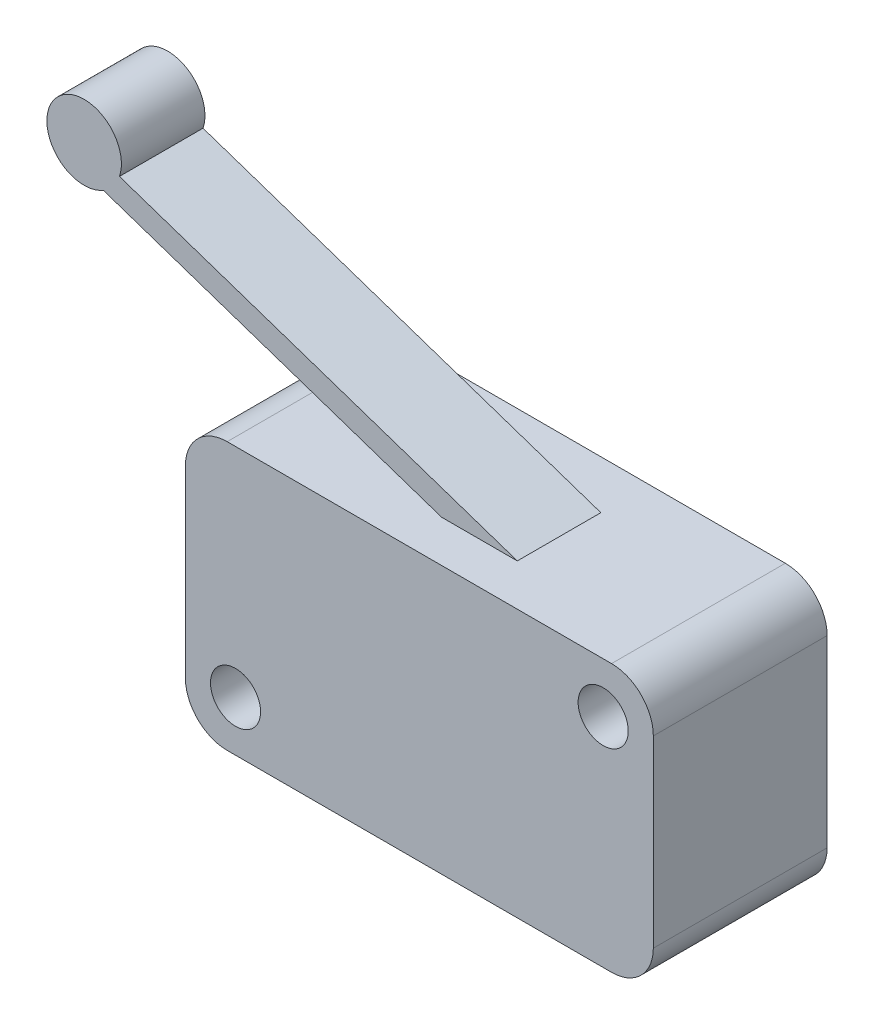
ISO-10303-21;
HEADER;
FILE_DESCRIPTION(('STEP AP214'),'2;1');
FILE_NAME('part.step','',(''),(''),'','','');
FILE_SCHEMA(('AUTOMOTIVE_DESIGN { 1 0 10303 214 1 1 1 1 }'));
ENDSEC;
DATA;
#1=APPLICATION_CONTEXT('core data for automotive mechanical design processes');
#2=APPLICATION_PROTOCOL_DEFINITION('international standard','automotive_design',2000,#1);
#3=PRODUCT_CONTEXT('',#1,'mechanical');
#4=PRODUCT('Part','Part','',(#3));
#5=PRODUCT_RELATED_PRODUCT_CATEGORY('part','',(#4));
#6=PRODUCT_DEFINITION_FORMATION('','',#4);
#7=PRODUCT_DEFINITION_CONTEXT('part definition',#1,'design');
#8=PRODUCT_DEFINITION('design','',#6,#7);
#9=PRODUCT_DEFINITION_SHAPE('','',#8);
#10=(LENGTH_UNIT() NAMED_UNIT(*) SI_UNIT(.MILLI.,.METRE.));
#11=(NAMED_UNIT(*) PLANE_ANGLE_UNIT() SI_UNIT($,.RADIAN.));
#12=(NAMED_UNIT(*) SI_UNIT($,.STERADIAN.) SOLID_ANGLE_UNIT());
#13=UNCERTAINTY_MEASURE_WITH_UNIT(LENGTH_MEASURE(1.E-05),#10,'distance_accuracy_value','');
#14=(GEOMETRIC_REPRESENTATION_CONTEXT(3) GLOBAL_UNCERTAINTY_ASSIGNED_CONTEXT((#13)) GLOBAL_UNIT_ASSIGNED_CONTEXT((#10,
#11,#12)) REPRESENTATION_CONTEXT('',''));
#15=CARTESIAN_POINT('',(0.,0.,0.));
#16=DIRECTION('',(0.,0.,1.));
#17=DIRECTION('',(1.,0.,0.));
#18=AXIS2_PLACEMENT_3D('',#15,#16,#17);
#19=CARTESIAN_POINT('',(0.,0.,10.4));
#20=DIRECTION('',(1.,0.,0.));
#21=DIRECTION('',(0.,0.,-1.));
#22=AXIS2_PLACEMENT_3D('',#19,#20,#21);
#23=PLANE('',#22);
#24=DIRECTION('',(0.,-1.,0.));
#25=VECTOR('',#24,1.);
#26=CARTESIAN_POINT('',(0.,0.,0.));
#27=LINE('',#26,#25);
#28=CARTESIAN_POINT('',(0.,13.5,0.));
#29=VERTEX_POINT('',#28);
#30=CARTESIAN_POINT('',(0.,2.5,0.));
#31=VERTEX_POINT('',#30);
#32=EDGE_CURVE('E167',#29,#31,#27,.T.);
#33=ORIENTED_EDGE('',*,*,#32,.T.);
#34=DIRECTION('',(0.,0.,-1.));
#35=VECTOR('',#34,1.);
#36=CARTESIAN_POINT('',(0.,2.5,10.4));
#37=LINE('',#36,#35);
#38=CARTESIAN_POINT('',(0.,2.5,10.4));
#39=VERTEX_POINT('',#38);
#40=EDGE_CURVE('E233',#31,#39,#37,.F.);
#41=ORIENTED_EDGE('',*,*,#40,.T.);
#42=DIRECTION('',(0.,-1.,0.));
#43=VECTOR('',#42,1.);
#44=CARTESIAN_POINT('',(0.,0.,10.4));
#45=LINE('',#44,#43);
#46=CARTESIAN_POINT('',(0.,13.5,10.4));
#47=VERTEX_POINT('',#46);
#48=EDGE_CURVE('E179',#47,#39,#45,.T.);
#49=ORIENTED_EDGE('',*,*,#48,.F.);
#50=DIRECTION('',(0.,0.,-1.));
#51=VECTOR('',#50,1.);
#52=CARTESIAN_POINT('',(0.,13.5,10.4));
#53=LINE('',#52,#51);
#54=EDGE_CURVE('E229',#47,#29,#53,.T.);
#55=ORIENTED_EDGE('',*,*,#54,.T.);
#56=EDGE_LOOP('',(#33,#41,#49,#55));
#57=FACE_BOUND('',#56,.T.);
#58=ADVANCED_FACE('F39',(#57),#23,.F.);
#59=CARTESIAN_POINT('',(0.,0.,10.4));
#60=DIRECTION('',(0.,1.,0.));
#61=DIRECTION('',(0.,0.,1.));
#62=AXIS2_PLACEMENT_3D('',#59,#60,#61);
#63=PLANE('',#62);
#64=DIRECTION('',(1.,0.,0.));
#65=VECTOR('',#64,1.);
#66=CARTESIAN_POINT('',(0.,0.,10.4));
#67=LINE('',#66,#65);
#68=CARTESIAN_POINT('',(2.5,0.,10.4));
#69=VERTEX_POINT('',#68);
#70=CARTESIAN_POINT('',(25.5,0.,10.4));
#71=VERTEX_POINT('',#70);
#72=EDGE_CURVE('E183',#69,#71,#67,.T.);
#73=ORIENTED_EDGE('',*,*,#72,.F.);
#74=DIRECTION('',(0.,0.,-1.));
#75=VECTOR('',#74,1.);
#76=CARTESIAN_POINT('',(2.5,0.,10.4));
#77=LINE('',#76,#75);
#78=CARTESIAN_POINT('',(2.5,0.,0.));
#79=VERTEX_POINT('',#78);
#80=EDGE_CURVE('E213',#69,#79,#77,.T.);
#81=ORIENTED_EDGE('',*,*,#80,.T.);
#82=DIRECTION('',(1.,0.,0.));
#83=VECTOR('',#82,1.);
#84=CARTESIAN_POINT('',(0.,0.,0.));
#85=LINE('',#84,#83);
#86=CARTESIAN_POINT('',(25.5,0.,0.));
#87=VERTEX_POINT('',#86);
#88=EDGE_CURVE('E200',#79,#87,#85,.T.);
#89=ORIENTED_EDGE('',*,*,#88,.T.);
#90=DIRECTION('',(0.,0.,-1.));
#91=VECTOR('',#90,1.);
#92=CARTESIAN_POINT('',(25.5,0.,10.4));
#93=LINE('',#92,#91);
#94=EDGE_CURVE('E196',#87,#71,#93,.F.);
#95=ORIENTED_EDGE('',*,*,#94,.T.);
#96=EDGE_LOOP('',(#73,#81,#89,#95));
#97=FACE_BOUND('',#96,.T.);
#98=ADVANCED_FACE('F288',(#97),#63,.F.);
#99=CARTESIAN_POINT('',(28.,0.,10.4));
#100=DIRECTION('',(-1.,0.,0.));
#101=DIRECTION('',(0.,0.,1.));
#102=AXIS2_PLACEMENT_3D('',#99,#100,#101);
#103=PLANE('',#102);
#104=DIRECTION('',(0.,1.,0.));
#105=VECTOR('',#104,1.);
#106=CARTESIAN_POINT('',(28.,0.,0.));
#107=LINE('',#106,#105);
#108=CARTESIAN_POINT('',(28.,2.5,0.));
#109=VERTEX_POINT('',#108);
#110=CARTESIAN_POINT('',(28.,13.5,0.));
#111=VERTEX_POINT('',#110);
#112=EDGE_CURVE('E204',#109,#111,#107,.T.);
#113=ORIENTED_EDGE('',*,*,#112,.T.);
#114=DIRECTION('',(0.,0.,-1.));
#115=VECTOR('',#114,1.);
#116=CARTESIAN_POINT('',(28.,13.5,10.4));
#117=LINE('',#116,#115);
#118=CARTESIAN_POINT('',(28.,13.5,10.4));
#119=VERTEX_POINT('',#118);
#120=EDGE_CURVE('E259',#111,#119,#117,.F.);
#121=ORIENTED_EDGE('',*,*,#120,.T.);
#122=DIRECTION('',(0.,1.,0.));
#123=VECTOR('',#122,1.);
#124=CARTESIAN_POINT('',(28.,0.,10.4));
#125=LINE('',#124,#123);
#126=CARTESIAN_POINT('',(28.,2.5,10.4));
#127=VERTEX_POINT('',#126);
#128=EDGE_CURVE('E188',#127,#119,#125,.T.);
#129=ORIENTED_EDGE('',*,*,#128,.F.);
#130=DIRECTION('',(0.,0.,-1.));
#131=VECTOR('',#130,1.);
#132=CARTESIAN_POINT('',(28.,2.5,10.4));
#133=LINE('',#132,#131);
#134=EDGE_CURVE('E255',#127,#109,#133,.T.);
#135=ORIENTED_EDGE('',*,*,#134,.T.);
#136=EDGE_LOOP('',(#113,#121,#129,#135));
#137=FACE_BOUND('',#136,.T.);
#138=ADVANCED_FACE('F294',(#137),#103,.F.);
#139=CARTESIAN_POINT('',(0.,16.,10.4));
#140=DIRECTION('',(0.,-1.,0.));
#141=DIRECTION('',(0.,0.,-1.));
#142=AXIS2_PLACEMENT_3D('',#139,#140,#141);
#143=PLANE('',#142);
#144=DIRECTION('',(0.,0.,-1.));
#145=VECTOR('',#144,1.);
#146=CARTESIAN_POINT('',(12.8351158209879,16.,10.4));
#147=LINE('',#146,#145);
#148=CARTESIAN_POINT('',(12.8351158209879,16.,7.9));
#149=VERTEX_POINT('',#148);
#150=CARTESIAN_POINT('',(12.8351158209879,16.,2.9));
#151=VERTEX_POINT('',#150);
#152=EDGE_CURVE('E148',#149,#151,#147,.T.);
#153=ORIENTED_EDGE('',*,*,#152,.T.);
#154=DIRECTION('',(1.,0.,0.));
#155=VECTOR('',#154,1.);
#156=CARTESIAN_POINT('',(0.,16.,2.9));
#157=LINE('',#156,#155);
#158=CARTESIAN_POINT('',(17.3601842271773,16.,2.9));
#159=VERTEX_POINT('',#158);
#160=EDGE_CURVE('E48',#151,#159,#157,.T.);
#161=ORIENTED_EDGE('',*,*,#160,.T.);
#162=DIRECTION('',(0.,0.,1.));
#163=VECTOR('',#162,1.);
#164=CARTESIAN_POINT('',(17.3601842271773,16.,2.9));
#165=LINE('',#164,#163);
#166=CARTESIAN_POINT('',(17.3601842271773,16.,7.9));
#167=VERTEX_POINT('',#166);
#168=EDGE_CURVE('E159',#159,#167,#165,.T.);
#169=ORIENTED_EDGE('',*,*,#168,.T.);
#170=DIRECTION('',(1.,0.,0.));
#171=VECTOR('',#170,1.);
#172=CARTESIAN_POINT('',(0.,16.,7.9));
#173=LINE('',#172,#171);
#174=EDGE_CURVE('E262',#149,#167,#173,.T.);
#175=ORIENTED_EDGE('',*,*,#174,.F.);
#176=EDGE_LOOP('',(#153,#161,#169,#175));
#177=FACE_BOUND('',#176,.T.);
#178=DIRECTION('',(-1.,0.,0.));
#179=VECTOR('',#178,1.);
#180=CARTESIAN_POINT('',(0.,16.,0.));
#181=LINE('',#180,#179);
#182=CARTESIAN_POINT('',(25.5,16.,0.));
#183=VERTEX_POINT('',#182);
#184=CARTESIAN_POINT('',(2.5,16.,0.));
#185=VERTEX_POINT('',#184);
#186=EDGE_CURVE('E184',#183,#185,#181,.T.);
#187=ORIENTED_EDGE('',*,*,#186,.T.);
#188=DIRECTION('',(0.,0.,-1.));
#189=VECTOR('',#188,1.);
#190=CARTESIAN_POINT('',(2.5,16.,10.4));
#191=LINE('',#190,#189);
#192=CARTESIAN_POINT('',(2.5,16.,10.4));
#193=VERTEX_POINT('',#192);
#194=EDGE_CURVE('E252',#185,#193,#191,.F.);
#195=ORIENTED_EDGE('',*,*,#194,.T.);
#196=DIRECTION('',(-1.,0.,0.));
#197=VECTOR('',#196,1.);
#198=CARTESIAN_POINT('',(0.,16.,10.4));
#199=LINE('',#198,#197);
#200=CARTESIAN_POINT('',(25.5,16.,10.4));
#201=VERTEX_POINT('',#200);
#202=EDGE_CURVE('E192',#201,#193,#199,.T.);
#203=ORIENTED_EDGE('',*,*,#202,.F.);
#204=DIRECTION('',(0.,0.,-1.));
#205=VECTOR('',#204,1.);
#206=CARTESIAN_POINT('',(25.5,16.,10.4));
#207=LINE('',#206,#205);
#208=EDGE_CURVE('E248',#201,#183,#207,.T.);
#209=ORIENTED_EDGE('',*,*,#208,.T.);
#210=EDGE_LOOP('',(#187,#195,#203,#209));
#211=FACE_BOUND('',#210,.T.);
#212=ADVANCED_FACE('F270',(#177,#211),#143,.F.);
#213=CARTESIAN_POINT('',(0.,0.,10.4));
#214=DIRECTION('',(0.,0.,-1.));
#215=DIRECTION('',(-1.,0.,0.));
#216=AXIS2_PLACEMENT_3D('',#213,#214,#215);
#217=PLANE('',#216);
#218=CARTESIAN_POINT('',(3.,3.,10.4));
#219=DIRECTION('',(0.,0.,1.));
#220=DIRECTION('',(1.,0.,0.));
#221=AXIS2_PLACEMENT_3D('',#218,#219,#220);
#222=CIRCLE('',#221,1.5);
#223=CARTESIAN_POINT('',(4.5,3.,10.4));
#224=VERTEX_POINT('',#223);
#225=EDGE_CURVE('E168',#224,#224,#222,.T.);
#226=ORIENTED_EDGE('',*,*,#225,.F.);
#227=EDGE_LOOP('',(#226));
#228=FACE_BOUND('',#227,.T.);
#229=CARTESIAN_POINT('',(25.,13.,10.4));
#230=DIRECTION('',(0.,0.,1.));
#231=DIRECTION('',(1.,0.,0.));
#232=AXIS2_PLACEMENT_3D('',#229,#230,#231);
#233=CIRCLE('',#232,1.5);
#234=CARTESIAN_POINT('',(26.5,13.,10.4));
#235=VERTEX_POINT('',#234);
#236=EDGE_CURVE('E162',#235,#235,#233,.T.);
#237=ORIENTED_EDGE('',*,*,#236,.F.);
#238=EDGE_LOOP('',(#237));
#239=FACE_BOUND('',#238,.T.);
#240=ORIENTED_EDGE('',*,*,#48,.T.);
#241=CARTESIAN_POINT('',(2.5,2.5,10.4));
#242=DIRECTION('',(0.,0.,-1.));
#243=DIRECTION('',(-1.,0.,0.));
#244=AXIS2_PLACEMENT_3D('',#241,#242,#243);
#245=CIRCLE('',#244,2.5);
#246=EDGE_CURVE('E245',#39,#69,#245,.F.);
#247=ORIENTED_EDGE('',*,*,#246,.T.);
#248=ORIENTED_EDGE('',*,*,#72,.T.);
#249=CARTESIAN_POINT('',(25.5,2.5,10.4));
#250=DIRECTION('',(0.,0.,-1.));
#251=DIRECTION('',(-1.,0.,0.));
#252=AXIS2_PLACEMENT_3D('',#249,#250,#251);
#253=CIRCLE('',#252,2.5);
#254=EDGE_CURVE('E236',#71,#127,#253,.F.);
#255=ORIENTED_EDGE('',*,*,#254,.T.);
#256=ORIENTED_EDGE('',*,*,#128,.T.);
#257=CARTESIAN_POINT('',(25.5,13.5,10.4));
#258=DIRECTION('',(0.,0.,-1.));
#259=DIRECTION('',(-1.,0.,0.));
#260=AXIS2_PLACEMENT_3D('',#257,#258,#259);
#261=CIRCLE('',#260,2.5);
#262=EDGE_CURVE('E239',#119,#201,#261,.F.);
#263=ORIENTED_EDGE('',*,*,#262,.T.);
#264=ORIENTED_EDGE('',*,*,#202,.T.);
#265=CARTESIAN_POINT('',(2.5,13.5,10.4));
#266=DIRECTION('',(0.,0.,-1.));
#267=DIRECTION('',(-1.,0.,0.));
#268=AXIS2_PLACEMENT_3D('',#265,#266,#267);
#269=CIRCLE('',#268,2.5);
#270=EDGE_CURVE('E242',#193,#47,#269,.F.);
#271=ORIENTED_EDGE('',*,*,#270,.T.);
#272=EDGE_LOOP('',(#240,#247,#248,#255,#256,#263,#264,#271));
#273=FACE_BOUND('',#272,.T.);
#274=ADVANCED_FACE('F319',(#228,#239,#273),#217,.F.);
#275=CARTESIAN_POINT('',(0.,0.,0.));
#276=DIRECTION('',(0.,0.,-1.));
#277=DIRECTION('',(-1.,0.,0.));
#278=AXIS2_PLACEMENT_3D('',#275,#276,#277);
#279=PLANE('',#278);
#280=CARTESIAN_POINT('',(3.,3.,0.));
#281=DIRECTION('',(0.,0.,1.));
#282=DIRECTION('',(1.,0.,0.));
#283=AXIS2_PLACEMENT_3D('',#280,#281,#282);
#284=CIRCLE('',#283,1.5);
#285=CARTESIAN_POINT('',(4.5,3.,0.));
#286=VERTEX_POINT('',#285);
#287=EDGE_CURVE('E163',#286,#286,#284,.T.);
#288=ORIENTED_EDGE('',*,*,#287,.T.);
#289=EDGE_LOOP('',(#288));
#290=FACE_BOUND('',#289,.T.);
#291=CARTESIAN_POINT('',(25.,13.,0.));
#292=DIRECTION('',(0.,0.,1.));
#293=DIRECTION('',(1.,0.,0.));
#294=AXIS2_PLACEMENT_3D('',#291,#292,#293);
#295=CIRCLE('',#294,1.5);
#296=CARTESIAN_POINT('',(26.5,13.,0.));
#297=VERTEX_POINT('',#296);
#298=EDGE_CURVE('E172',#297,#297,#295,.T.);
#299=ORIENTED_EDGE('',*,*,#298,.T.);
#300=EDGE_LOOP('',(#299));
#301=FACE_BOUND('',#300,.T.);
#302=ORIENTED_EDGE('',*,*,#88,.F.);
#303=CARTESIAN_POINT('',(2.5,2.5,0.));
#304=DIRECTION('',(0.,0.,-1.));
#305=DIRECTION('',(-1.,0.,0.));
#306=AXIS2_PLACEMENT_3D('',#303,#304,#305);
#307=CIRCLE('',#306,2.5);
#308=EDGE_CURVE('E226',#79,#31,#307,.T.);
#309=ORIENTED_EDGE('',*,*,#308,.T.);
#310=ORIENTED_EDGE('',*,*,#32,.F.);
#311=CARTESIAN_POINT('',(2.5,13.5,0.));
#312=DIRECTION('',(0.,0.,-1.));
#313=DIRECTION('',(-1.,0.,0.));
#314=AXIS2_PLACEMENT_3D('',#311,#312,#313);
#315=CIRCLE('',#314,2.5);
#316=EDGE_CURVE('E223',#29,#185,#315,.T.);
#317=ORIENTED_EDGE('',*,*,#316,.T.);
#318=ORIENTED_EDGE('',*,*,#186,.F.);
#319=CARTESIAN_POINT('',(25.5,13.5,0.));
#320=DIRECTION('',(0.,0.,-1.));
#321=DIRECTION('',(-1.,0.,0.));
#322=AXIS2_PLACEMENT_3D('',#319,#320,#321);
#323=CIRCLE('',#322,2.5);
#324=EDGE_CURVE('E220',#183,#111,#323,.T.);
#325=ORIENTED_EDGE('',*,*,#324,.T.);
#326=ORIENTED_EDGE('',*,*,#112,.F.);
#327=CARTESIAN_POINT('',(25.5,2.5,0.));
#328=DIRECTION('',(0.,0.,-1.));
#329=DIRECTION('',(-1.,0.,0.));
#330=AXIS2_PLACEMENT_3D('',#327,#328,#329);
#331=CIRCLE('',#330,2.5);
#332=EDGE_CURVE('E217',#109,#87,#331,.T.);
#333=ORIENTED_EDGE('',*,*,#332,.T.);
#334=EDGE_LOOP('',(#302,#309,#310,#317,#318,#325,#326,#333));
#335=FACE_BOUND('',#334,.T.);
#336=ADVANCED_FACE('F338',(#290,#301,#335),#279,.T.);
#337=CARTESIAN_POINT('',(25.,13.,0.));
#338=DIRECTION('',(0.,0.,1.));
#339=DIRECTION('',(1.,0.,0.));
#340=AXIS2_PLACEMENT_3D('',#337,#338,#339);
#341=CYLINDRICAL_SURFACE('',#340,1.5);
#342=ORIENTED_EDGE('',*,*,#298,.F.);
#343=EDGE_LOOP('',(#342));
#344=FACE_BOUND('',#343,.T.);
#345=ORIENTED_EDGE('',*,*,#236,.T.);
#346=EDGE_LOOP('',(#345));
#347=FACE_BOUND('',#346,.T.);
#348=ADVANCED_FACE('F340',(#344,#347),#341,.F.);
#349=CARTESIAN_POINT('',(3.,3.,0.));
#350=DIRECTION('',(0.,0.,1.));
#351=DIRECTION('',(1.,0.,0.));
#352=AXIS2_PLACEMENT_3D('',#349,#350,#351);
#353=CYLINDRICAL_SURFACE('',#352,1.5);
#354=ORIENTED_EDGE('',*,*,#287,.F.);
#355=EDGE_LOOP('',(#354));
#356=FACE_BOUND('',#355,.T.);
#357=ORIENTED_EDGE('',*,*,#225,.T.);
#358=EDGE_LOOP('',(#357));
#359=FACE_BOUND('',#358,.T.);
#360=ADVANCED_FACE('F303',(#356,#359),#353,.F.);
#361=CARTESIAN_POINT('',(2.5,2.5,10.4));
#362=DIRECTION('',(0.,0.,-1.));
#363=DIRECTION('',(-1.,0.,0.));
#364=AXIS2_PLACEMENT_3D('',#361,#362,#363);
#365=CYLINDRICAL_SURFACE('',#364,2.5);
#366=ORIENTED_EDGE('',*,*,#246,.F.);
#367=ORIENTED_EDGE('',*,*,#40,.F.);
#368=ORIENTED_EDGE('',*,*,#308,.F.);
#369=ORIENTED_EDGE('',*,*,#80,.F.);
#370=EDGE_LOOP('',(#366,#367,#368,#369));
#371=FACE_BOUND('',#370,.T.);
#372=ADVANCED_FACE('F299',(#371),#365,.T.);
#373=CARTESIAN_POINT('',(2.5,13.5,10.4));
#374=DIRECTION('',(0.,0.,-1.));
#375=DIRECTION('',(-1.,0.,0.));
#376=AXIS2_PLACEMENT_3D('',#373,#374,#375);
#377=CYLINDRICAL_SURFACE('',#376,2.5);
#378=ORIENTED_EDGE('',*,*,#270,.F.);
#379=ORIENTED_EDGE('',*,*,#194,.F.);
#380=ORIENTED_EDGE('',*,*,#316,.F.);
#381=ORIENTED_EDGE('',*,*,#54,.F.);
#382=EDGE_LOOP('',(#378,#379,#380,#381));
#383=FACE_BOUND('',#382,.T.);
#384=ADVANCED_FACE('F302',(#383),#377,.T.);
#385=CARTESIAN_POINT('',(25.5,13.5,10.4));
#386=DIRECTION('',(0.,0.,-1.));
#387=DIRECTION('',(-1.,0.,0.));
#388=AXIS2_PLACEMENT_3D('',#385,#386,#387);
#389=CYLINDRICAL_SURFACE('',#388,2.5);
#390=ORIENTED_EDGE('',*,*,#262,.F.);
#391=ORIENTED_EDGE('',*,*,#120,.F.);
#392=ORIENTED_EDGE('',*,*,#324,.F.);
#393=ORIENTED_EDGE('',*,*,#208,.F.);
#394=EDGE_LOOP('',(#390,#391,#392,#393));
#395=FACE_BOUND('',#394,.T.);
#396=ADVANCED_FACE('F306',(#395),#389,.T.);
#397=CARTESIAN_POINT('',(25.5,2.5,10.4));
#398=DIRECTION('',(0.,0.,-1.));
#399=DIRECTION('',(-1.,0.,0.));
#400=AXIS2_PLACEMENT_3D('',#397,#398,#399);
#401=CYLINDRICAL_SURFACE('',#400,2.5);
#402=ORIENTED_EDGE('',*,*,#254,.F.);
#403=ORIENTED_EDGE('',*,*,#94,.F.);
#404=ORIENTED_EDGE('',*,*,#332,.F.);
#405=ORIENTED_EDGE('',*,*,#134,.F.);
#406=EDGE_LOOP('',(#402,#403,#404,#405));
#407=FACE_BOUND('',#406,.T.);
#408=ADVANCED_FACE('F41',(#407),#401,.T.);
#409=CARTESIAN_POINT('',(-9.83576629643326,23.6376710293523,2.9));
#410=DIRECTION('',(-0.319262543730446,-0.947666306339296,0.));
#411=DIRECTION('',(0.947666306339296,-0.319262543730446,0.));
#412=AXIS2_PLACEMENT_3D('',#409,#410,#411);
#413=PLANE('',#412);
#414=DIRECTION('',(0.,0.,1.));
#415=VECTOR('',#414,1.);
#416=CARTESIAN_POINT('',(-7.41237877248516,22.8212477164575,2.9));
#417=LINE('',#416,#415);
#418=CARTESIAN_POINT('',(-7.41237877248516,22.8212477164575,2.9));
#419=VERTEX_POINT('',#418);
#420=CARTESIAN_POINT('',(-7.41237877248516,22.8212477164575,7.9));
#421=VERTEX_POINT('',#420);
#422=EDGE_CURVE('E127',#419,#421,#417,.T.);
#423=ORIENTED_EDGE('',*,*,#422,.F.);
#424=DIRECTION('',(0.947666306339296,-0.319262543730446,0.));
#425=VECTOR('',#424,1.);
#426=CARTESIAN_POINT('',(-9.83576629643326,23.6376710293523,2.9));
#427=LINE('',#426,#425);
#428=EDGE_CURVE('E55',#419,#151,#427,.T.);
#429=ORIENTED_EDGE('',*,*,#428,.T.);
#430=ORIENTED_EDGE('',*,*,#152,.F.);
#431=DIRECTION('',(0.947666306339296,-0.319262543730446,0.));
#432=VECTOR('',#431,1.);
#433=CARTESIAN_POINT('',(-9.83576629643326,23.6376710293523,7.9));
#434=LINE('',#433,#432);
#435=EDGE_CURVE('E142',#421,#149,#434,.T.);
#436=ORIENTED_EDGE('',*,*,#435,.F.);
#437=EDGE_LOOP('',(#423,#429,#430,#436));
#438=FACE_BOUND('',#437,.T.);
#439=ADVANCED_FACE('F147',(#438),#413,.T.);
#440=CARTESIAN_POINT('',(0.,0.,2.9));
#441=DIRECTION('',(0.,0.,-1.));
#442=DIRECTION('',(-1.,0.,0.));
#443=AXIS2_PLACEMENT_3D('',#440,#441,#442);
#444=PLANE('',#443);
#445=ORIENTED_EDGE('',*,*,#428,.F.);
#446=CARTESIAN_POINT('',(-8.5599726212601,24.7323303086408,2.9));
#447=DIRECTION('',(0.,0.,1.));
#448=DIRECTION('',(1.,0.,0.));
#449=AXIS2_PLACEMENT_3D('',#446,#447,#448);
#450=CIRCLE('',#449,2.22917211446131);
#451=CARTESIAN_POINT('',(-6.447461317354,24.0206391489649,2.9));
#452=VERTEX_POINT('',#451);
#453=EDGE_CURVE('E133',#452,#419,#450,.T.);
#454=ORIENTED_EDGE('',*,*,#453,.F.);
#455=DIRECTION('',(-0.947666306339296,0.319262543730446,0.));
#456=VECTOR('',#455,1.);
#457=CARTESIAN_POINT('',(17.3601842271773,16.,2.9));
#458=LINE('',#457,#456);
#459=EDGE_CURVE('E150',#159,#452,#458,.T.);
#460=ORIENTED_EDGE('',*,*,#459,.F.);
#461=ORIENTED_EDGE('',*,*,#160,.F.);
#462=EDGE_LOOP('',(#445,#454,#460,#461));
#463=FACE_BOUND('',#462,.T.);
#464=ADVANCED_FACE('F274',(#463),#444,.T.);
#465=CARTESIAN_POINT('',(0.,0.,7.9));
#466=DIRECTION('',(0.,0.,-1.));
#467=DIRECTION('',(-1.,0.,0.));
#468=AXIS2_PLACEMENT_3D('',#465,#466,#467);
#469=PLANE('',#468);
#470=CARTESIAN_POINT('',(-8.5599726212601,24.7323303086408,7.9));
#471=DIRECTION('',(0.,0.,1.));
#472=DIRECTION('',(1.,0.,0.));
#473=AXIS2_PLACEMENT_3D('',#470,#471,#472);
#474=CIRCLE('',#473,2.22917211446131);
#475=CARTESIAN_POINT('',(-6.447461317354,24.0206391489649,7.9));
#476=VERTEX_POINT('',#475);
#477=EDGE_CURVE('E130',#476,#421,#474,.T.);
#478=ORIENTED_EDGE('',*,*,#477,.T.);
#479=ORIENTED_EDGE('',*,*,#435,.T.);
#480=ORIENTED_EDGE('',*,*,#174,.T.);
#481=DIRECTION('',(-0.947666306339296,0.319262543730446,0.));
#482=VECTOR('',#481,1.);
#483=CARTESIAN_POINT('',(17.3601842271773,16.,7.9));
#484=LINE('',#483,#482);
#485=EDGE_CURVE('E136',#167,#476,#484,.T.);
#486=ORIENTED_EDGE('',*,*,#485,.T.);
#487=EDGE_LOOP('',(#478,#479,#480,#486));
#488=FACE_BOUND('',#487,.T.);
#489=ADVANCED_FACE('F140',(#488),#469,.F.);
#490=CARTESIAN_POINT('',(17.3601842271773,16.,2.9));
#491=DIRECTION('',(0.319262543730446,0.947666306339296,0.));
#492=DIRECTION('',(-0.947666306339296,0.319262543730446,0.));
#493=AXIS2_PLACEMENT_3D('',#490,#491,#492);
#494=PLANE('',#493);
#495=DIRECTION('',(0.,0.,1.));
#496=VECTOR('',#495,1.);
#497=CARTESIAN_POINT('',(-6.447461317354,24.0206391489649,2.9));
#498=LINE('',#497,#496);
#499=EDGE_CURVE('E11',#476,#452,#498,.F.);
#500=ORIENTED_EDGE('',*,*,#499,.F.);
#501=ORIENTED_EDGE('',*,*,#485,.F.);
#502=ORIENTED_EDGE('',*,*,#168,.F.);
#503=ORIENTED_EDGE('',*,*,#459,.T.);
#504=EDGE_LOOP('',(#500,#501,#502,#503));
#505=FACE_BOUND('',#504,.T.);
#506=ADVANCED_FACE('F276',(#505),#494,.T.);
#507=CARTESIAN_POINT('',(-8.5599726212601,24.7323303086408,2.9));
#508=DIRECTION('',(0.,0.,1.));
#509=DIRECTION('',(1.,0.,0.));
#510=AXIS2_PLACEMENT_3D('',#507,#508,#509);
#511=CYLINDRICAL_SURFACE('',#510,2.22917211446131);
#512=ORIENTED_EDGE('',*,*,#453,.T.);
#513=ORIENTED_EDGE('',*,*,#422,.T.);
#514=ORIENTED_EDGE('',*,*,#477,.F.);
#515=ORIENTED_EDGE('',*,*,#499,.T.);
#516=EDGE_LOOP('',(#512,#513,#514,#515));
#517=FACE_BOUND('',#516,.T.);
#518=ADVANCED_FACE('F129',(#517),#511,.T.);
#519=CLOSED_SHELL('',(#58,#98,#138,#212,#274,#336,#348,#360,#372,#384,#396,#408,#439,#464,#489,
#506,#518));
#520=MANIFOLD_SOLID_BREP('B2',#519);
#521=ADVANCED_BREP_SHAPE_REPRESENTATION('',(#18,#520),#14);
#522=SHAPE_DEFINITION_REPRESENTATION(#9,#521);
ENDSEC;
END-ISO-10303-21;
